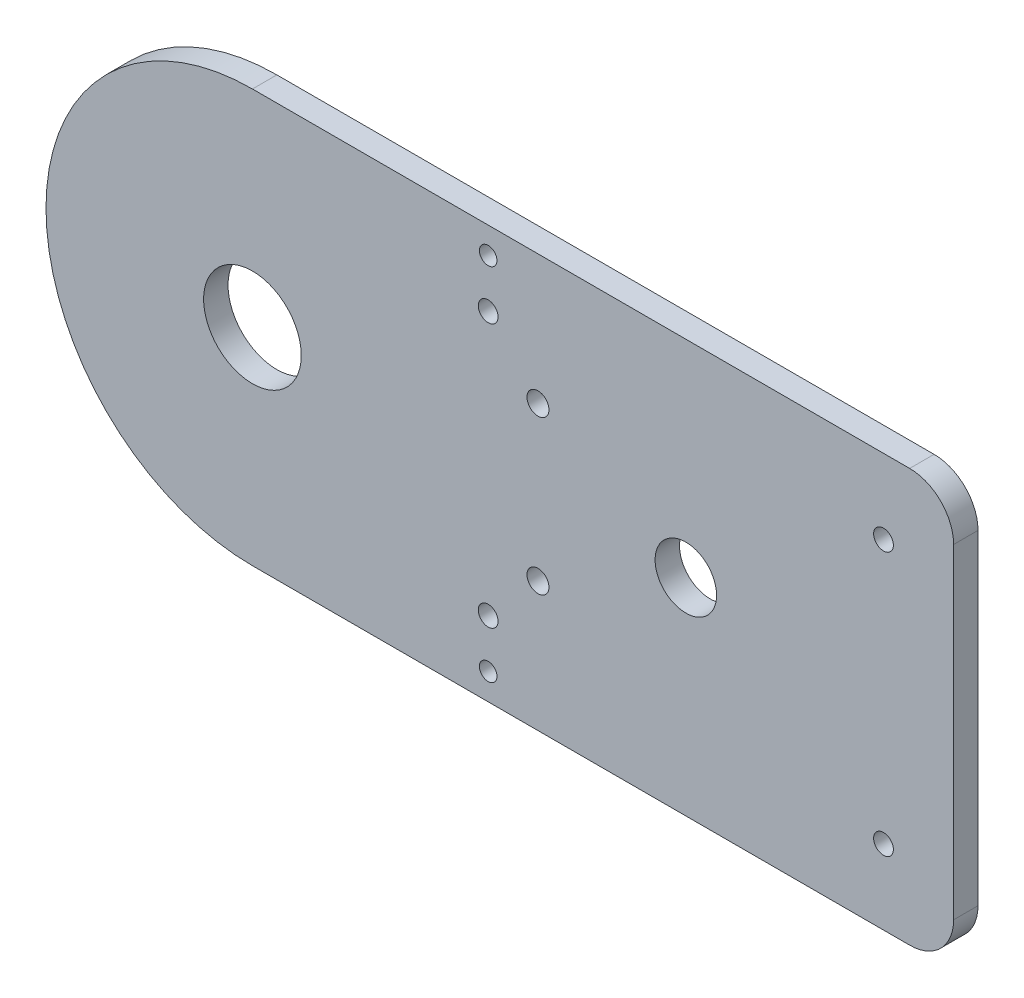
ISO-10303-21;
HEADER;
FILE_DESCRIPTION(('STEP AP214'),'2;1');
FILE_NAME('part.step','',(''),(''),'','','');
FILE_SCHEMA(('AUTOMOTIVE_DESIGN { 1 0 10303 214 1 1 1 1 }'));
ENDSEC;
DATA;
#1=APPLICATION_CONTEXT('core data for automotive mechanical design processes');
#2=APPLICATION_PROTOCOL_DEFINITION('international standard','automotive_design',2000,#1);
#3=PRODUCT_CONTEXT('',#1,'mechanical');
#4=PRODUCT('Part','Part','',(#3));
#5=PRODUCT_RELATED_PRODUCT_CATEGORY('part','',(#4));
#6=PRODUCT_DEFINITION_FORMATION('','',#4);
#7=PRODUCT_DEFINITION_CONTEXT('part definition',#1,'design');
#8=PRODUCT_DEFINITION('design','',#6,#7);
#9=PRODUCT_DEFINITION_SHAPE('','',#8);
#10=(LENGTH_UNIT() NAMED_UNIT(*) SI_UNIT(.MILLI.,.METRE.));
#11=(NAMED_UNIT(*) PLANE_ANGLE_UNIT() SI_UNIT($,.RADIAN.));
#12=(NAMED_UNIT(*) SI_UNIT($,.STERADIAN.) SOLID_ANGLE_UNIT());
#13=UNCERTAINTY_MEASURE_WITH_UNIT(LENGTH_MEASURE(1.E-05),#10,'distance_accuracy_value','');
#14=(GEOMETRIC_REPRESENTATION_CONTEXT(3) GLOBAL_UNCERTAINTY_ASSIGNED_CONTEXT((#13)) GLOBAL_UNIT_ASSIGNED_CONTEXT((#10,
#11,#12)) REPRESENTATION_CONTEXT('',''));
#15=CARTESIAN_POINT('',(0.,0.,0.));
#16=DIRECTION('',(0.,0.,1.));
#17=DIRECTION('',(1.,0.,0.));
#18=AXIS2_PLACEMENT_3D('',#15,#16,#17);
#19=CARTESIAN_POINT('',(-65.,0.,5.55625));
#20=DIRECTION('',(0.,0.,1.));
#21=DIRECTION('',(1.,0.,0.));
#22=AXIS2_PLACEMENT_3D('',#19,#20,#21);
#23=PLANE('',#22);
#24=CARTESIAN_POINT('',(0.,17.5,5.55625));
#25=DIRECTION('',(0.,0.,1.));
#26=DIRECTION('',(1.,0.,0.));
#27=AXIS2_PLACEMENT_3D('',#24,#25,#26);
#28=CIRCLE('',#27,2.5);
#29=CARTESIAN_POINT('',(2.49999999999999,17.5,5.55625));
#30=VERTEX_POINT('',#29);
#31=EDGE_CURVE('E151',#30,#30,#28,.T.);
#32=ORIENTED_EDGE('',*,*,#31,.F.);
#33=EDGE_LOOP('',(#32));
#34=FACE_BOUND('',#33,.T.);
#35=CARTESIAN_POINT('',(0.,-17.5,5.55625));
#36=DIRECTION('',(0.,0.,1.));
#37=DIRECTION('',(1.,0.,0.));
#38=AXIS2_PLACEMENT_3D('',#35,#36,#37);
#39=CIRCLE('',#38,2.5);
#40=CARTESIAN_POINT('',(2.5,-17.5,5.55625));
#41=VERTEX_POINT('',#40);
#42=EDGE_CURVE('E157',#41,#41,#39,.T.);
#43=ORIENTED_EDGE('',*,*,#42,.F.);
#44=EDGE_LOOP('',(#43));
#45=FACE_BOUND('',#44,.T.);
#46=CARTESIAN_POINT('',(-11.3336023189377,41.,5.55625));
#47=DIRECTION('',(0.,0.,1.));
#48=DIRECTION('',(1.,0.,0.));
#49=AXIS2_PLACEMENT_3D('',#46,#47,#48);
#50=CIRCLE('',#49,2.);
#51=CARTESIAN_POINT('',(-9.33360231893767,41.,5.55625));
#52=VERTEX_POINT('',#51);
#53=EDGE_CURVE('E155',#52,#52,#50,.T.);
#54=ORIENTED_EDGE('',*,*,#53,.F.);
#55=EDGE_LOOP('',(#54));
#56=FACE_BOUND('',#55,.T.);
#57=CARTESIAN_POINT('',(78.6663976810623,-30.,5.55625));
#58=DIRECTION('',(0.,0.,1.));
#59=DIRECTION('',(1.,0.,0.));
#60=AXIS2_PLACEMENT_3D('',#57,#58,#59);
#61=CIRCLE('',#60,2.25);
#62=CARTESIAN_POINT('',(80.9163976810623,-30.,5.55625));
#63=VERTEX_POINT('',#62);
#64=EDGE_CURVE('E171',#63,#63,#61,.T.);
#65=ORIENTED_EDGE('',*,*,#64,.F.);
#66=EDGE_LOOP('',(#65));
#67=FACE_BOUND('',#66,.T.);
#68=CARTESIAN_POINT('',(-11.3336023189377,30.,5.55625));
#69=DIRECTION('',(0.,0.,1.));
#70=DIRECTION('',(1.,0.,0.));
#71=AXIS2_PLACEMENT_3D('',#68,#69,#70);
#72=CIRCLE('',#71,2.25);
#73=CARTESIAN_POINT('',(-9.08360231893768,30.,5.55625));
#74=VERTEX_POINT('',#73);
#75=EDGE_CURVE('E167',#74,#74,#72,.T.);
#76=ORIENTED_EDGE('',*,*,#75,.F.);
#77=EDGE_LOOP('',(#76));
#78=FACE_BOUND('',#77,.T.);
#79=CARTESIAN_POINT('',(-11.3336023189377,-30.,5.55625));
#80=DIRECTION('',(0.,0.,1.));
#81=DIRECTION('',(1.,0.,0.));
#82=AXIS2_PLACEMENT_3D('',#79,#80,#81);
#83=CIRCLE('',#82,2.25);
#84=CARTESIAN_POINT('',(-9.08360231893768,-30.,5.55625));
#85=VERTEX_POINT('',#84);
#86=EDGE_CURVE('E164',#85,#85,#83,.T.);
#87=ORIENTED_EDGE('',*,*,#86,.F.);
#88=EDGE_LOOP('',(#87));
#89=FACE_BOUND('',#88,.T.);
#90=CARTESIAN_POINT('',(-11.3336023189377,-41.,5.55625));
#91=DIRECTION('',(0.,0.,1.));
#92=DIRECTION('',(1.,0.,0.));
#93=AXIS2_PLACEMENT_3D('',#90,#91,#92);
#94=CIRCLE('',#93,2.);
#95=CARTESIAN_POINT('',(-9.33360231893767,-41.,5.55625));
#96=VERTEX_POINT('',#95);
#97=EDGE_CURVE('E168',#96,#96,#94,.T.);
#98=ORIENTED_EDGE('',*,*,#97,.F.);
#99=EDGE_LOOP('',(#98));
#100=FACE_BOUND('',#99,.T.);
#101=CARTESIAN_POINT('',(78.6663976810623,30.,5.55625));
#102=DIRECTION('',(0.,0.,1.));
#103=DIRECTION('',(1.,0.,0.));
#104=AXIS2_PLACEMENT_3D('',#101,#102,#103);
#105=CIRCLE('',#104,2.25);
#106=CARTESIAN_POINT('',(80.9163976810623,30.,5.55625));
#107=VERTEX_POINT('',#106);
#108=EDGE_CURVE('E134',#107,#107,#105,.T.);
#109=ORIENTED_EDGE('',*,*,#108,.F.);
#110=EDGE_LOOP('',(#109));
#111=FACE_BOUND('',#110,.T.);
#112=CARTESIAN_POINT('',(33.6663976810623,0.,5.55625));
#113=DIRECTION('',(0.,0.,1.));
#114=DIRECTION('',(1.,0.,0.));
#115=AXIS2_PLACEMENT_3D('',#112,#113,#114);
#116=CIRCLE('',#115,7.);
#117=CARTESIAN_POINT('',(40.6663976810623,0.,5.55625));
#118=VERTEX_POINT('',#117);
#119=EDGE_CURVE('E148',#118,#118,#116,.T.);
#120=ORIENTED_EDGE('',*,*,#119,.F.);
#121=EDGE_LOOP('',(#120));
#122=FACE_BOUND('',#121,.T.);
#123=DIRECTION('',(1.,0.,0.));
#124=VECTOR('',#123,1.);
#125=CARTESIAN_POINT('',(94.62424518,-47.,5.55625));
#126=LINE('',#125,#124);
#127=CARTESIAN_POINT('',(-65.,-47.,5.55625));
#128=VERTEX_POINT('',#127);
#129=CARTESIAN_POINT('',(84.62424518,-47.,5.55625));
#130=VERTEX_POINT('',#129);
#131=EDGE_CURVE('E92',#128,#130,#126,.T.);
#132=ORIENTED_EDGE('',*,*,#131,.T.);
#133=CARTESIAN_POINT('',(84.62424518,-37.,5.55625));
#134=DIRECTION('',(0.,0.,1.));
#135=DIRECTION('',(1.,0.,0.));
#136=AXIS2_PLACEMENT_3D('',#133,#134,#135);
#137=CIRCLE('',#136,10.);
#138=CARTESIAN_POINT('',(94.62424518,-37.,5.55625));
#139=VERTEX_POINT('',#138);
#140=EDGE_CURVE('E46',#130,#139,#137,.T.);
#141=ORIENTED_EDGE('',*,*,#140,.T.);
#142=DIRECTION('',(0.,1.,0.));
#143=VECTOR('',#142,1.);
#144=CARTESIAN_POINT('',(94.62424518,47.,5.55625));
#145=LINE('',#144,#143);
#146=CARTESIAN_POINT('',(94.62424518,37.,5.55625));
#147=VERTEX_POINT('',#146);
#148=EDGE_CURVE('E99',#139,#147,#145,.T.);
#149=ORIENTED_EDGE('',*,*,#148,.T.);
#150=CARTESIAN_POINT('',(84.62424518,37.,5.55625));
#151=DIRECTION('',(0.,0.,1.));
#152=DIRECTION('',(1.,0.,0.));
#153=AXIS2_PLACEMENT_3D('',#150,#151,#152);
#154=CIRCLE('',#153,10.);
#155=CARTESIAN_POINT('',(84.62424518,47.,5.55625));
#156=VERTEX_POINT('',#155);
#157=EDGE_CURVE('E54',#147,#156,#154,.T.);
#158=ORIENTED_EDGE('',*,*,#157,.T.);
#159=DIRECTION('',(-1.,0.,0.));
#160=VECTOR('',#159,1.);
#161=CARTESIAN_POINT('',(-65.,47.,5.55625));
#162=LINE('',#161,#160);
#163=CARTESIAN_POINT('',(-65.,47.,5.55625));
#164=VERTEX_POINT('',#163);
#165=EDGE_CURVE('E104',#156,#164,#162,.T.);
#166=ORIENTED_EDGE('',*,*,#165,.T.);
#167=CARTESIAN_POINT('',(-65.,0.,5.55625));
#168=DIRECTION('',(0.,0.,1.));
#169=DIRECTION('',(1.,0.,0.));
#170=AXIS2_PLACEMENT_3D('',#167,#168,#169);
#171=CIRCLE('',#170,47.);
#172=EDGE_CURVE('E100',#164,#128,#171,.T.);
#173=ORIENTED_EDGE('',*,*,#172,.T.);
#174=EDGE_LOOP('',(#132,#141,#149,#158,#166,#173));
#175=FACE_BOUND('',#174,.T.);
#176=CARTESIAN_POINT('',(-65.,0.,5.55625));
#177=DIRECTION('',(0.,0.,1.));
#178=DIRECTION('',(1.,0.,0.));
#179=AXIS2_PLACEMENT_3D('',#176,#177,#178);
#180=CIRCLE('',#179,11.1125);
#181=CARTESIAN_POINT('',(-53.8875,0.,5.55625));
#182=VERTEX_POINT('',#181);
#183=EDGE_CURVE('E186',#182,#182,#180,.T.);
#184=ORIENTED_EDGE('',*,*,#183,.F.);
#185=EDGE_LOOP('',(#184));
#186=FACE_BOUND('',#185,.T.);
#187=ADVANCED_FACE('F37',(#34,#45,#56,#67,#78,#89,#100,#111,#122,#175,#186),#23,.T.);
#188=CARTESIAN_POINT('',(-65.,0.,0.));
#189=DIRECTION('',(0.,0.,1.));
#190=DIRECTION('',(1.,0.,0.));
#191=AXIS2_PLACEMENT_3D('',#188,#189,#190);
#192=PLANE('',#191);
#193=CARTESIAN_POINT('',(0.,17.5,0.));
#194=DIRECTION('',(0.,0.,1.));
#195=DIRECTION('',(1.,0.,0.));
#196=AXIS2_PLACEMENT_3D('',#193,#194,#195);
#197=CIRCLE('',#196,2.5);
#198=CARTESIAN_POINT('',(2.49999999999999,17.5,0.));
#199=VERTEX_POINT('',#198);
#200=EDGE_CURVE('E41',#199,#199,#197,.T.);
#201=ORIENTED_EDGE('',*,*,#200,.T.);
#202=EDGE_LOOP('',(#201));
#203=FACE_BOUND('',#202,.T.);
#204=CARTESIAN_POINT('',(0.,-17.5,0.));
#205=DIRECTION('',(0.,0.,1.));
#206=DIRECTION('',(1.,0.,0.));
#207=AXIS2_PLACEMENT_3D('',#204,#205,#206);
#208=CIRCLE('',#207,2.5);
#209=CARTESIAN_POINT('',(2.5,-17.5,0.));
#210=VERTEX_POINT('',#209);
#211=EDGE_CURVE('E149',#210,#210,#208,.T.);
#212=ORIENTED_EDGE('',*,*,#211,.T.);
#213=EDGE_LOOP('',(#212));
#214=FACE_BOUND('',#213,.T.);
#215=CARTESIAN_POINT('',(-11.3336023189377,41.,0.));
#216=DIRECTION('',(0.,0.,1.));
#217=DIRECTION('',(1.,0.,0.));
#218=AXIS2_PLACEMENT_3D('',#215,#216,#217);
#219=CIRCLE('',#218,2.);
#220=CARTESIAN_POINT('',(-9.33360231893767,41.,0.));
#221=VERTEX_POINT('',#220);
#222=EDGE_CURVE('E146',#221,#221,#219,.T.);
#223=ORIENTED_EDGE('',*,*,#222,.T.);
#224=EDGE_LOOP('',(#223));
#225=FACE_BOUND('',#224,.T.);
#226=CARTESIAN_POINT('',(78.6663976810623,-30.,0.));
#227=DIRECTION('',(0.,0.,1.));
#228=DIRECTION('',(1.,0.,0.));
#229=AXIS2_PLACEMENT_3D('',#226,#227,#228);
#230=CIRCLE('',#229,2.25);
#231=CARTESIAN_POINT('',(80.9163976810623,-30.,0.));
#232=VERTEX_POINT('',#231);
#233=EDGE_CURVE('E143',#232,#232,#230,.T.);
#234=ORIENTED_EDGE('',*,*,#233,.T.);
#235=EDGE_LOOP('',(#234));
#236=FACE_BOUND('',#235,.T.);
#237=CARTESIAN_POINT('',(-11.3336023189377,30.,0.));
#238=DIRECTION('',(0.,0.,1.));
#239=DIRECTION('',(1.,0.,0.));
#240=AXIS2_PLACEMENT_3D('',#237,#238,#239);
#241=CIRCLE('',#240,2.25);
#242=CARTESIAN_POINT('',(-9.08360231893768,30.,0.));
#243=VERTEX_POINT('',#242);
#244=EDGE_CURVE('E140',#243,#243,#241,.T.);
#245=ORIENTED_EDGE('',*,*,#244,.T.);
#246=EDGE_LOOP('',(#245));
#247=FACE_BOUND('',#246,.T.);
#248=CARTESIAN_POINT('',(-11.3336023189377,-30.,0.));
#249=DIRECTION('',(0.,0.,1.));
#250=DIRECTION('',(1.,0.,0.));
#251=AXIS2_PLACEMENT_3D('',#248,#249,#250);
#252=CIRCLE('',#251,2.25);
#253=CARTESIAN_POINT('',(-9.08360231893768,-30.,0.));
#254=VERTEX_POINT('',#253);
#255=EDGE_CURVE('E137',#254,#254,#252,.T.);
#256=ORIENTED_EDGE('',*,*,#255,.T.);
#257=EDGE_LOOP('',(#256));
#258=FACE_BOUND('',#257,.T.);
#259=CARTESIAN_POINT('',(-11.3336023189377,-41.,0.));
#260=DIRECTION('',(0.,0.,1.));
#261=DIRECTION('',(1.,0.,0.));
#262=AXIS2_PLACEMENT_3D('',#259,#260,#261);
#263=CIRCLE('',#262,2.);
#264=CARTESIAN_POINT('',(-9.33360231893767,-41.,0.));
#265=VERTEX_POINT('',#264);
#266=EDGE_CURVE('E133',#265,#265,#263,.T.);
#267=ORIENTED_EDGE('',*,*,#266,.T.);
#268=EDGE_LOOP('',(#267));
#269=FACE_BOUND('',#268,.T.);
#270=CARTESIAN_POINT('',(78.6663976810623,30.,0.));
#271=DIRECTION('',(0.,0.,1.));
#272=DIRECTION('',(1.,0.,0.));
#273=AXIS2_PLACEMENT_3D('',#270,#271,#272);
#274=CIRCLE('',#273,2.25);
#275=CARTESIAN_POINT('',(80.9163976810623,30.,0.));
#276=VERTEX_POINT('',#275);
#277=EDGE_CURVE('E130',#276,#276,#274,.T.);
#278=ORIENTED_EDGE('',*,*,#277,.T.);
#279=EDGE_LOOP('',(#278));
#280=FACE_BOUND('',#279,.T.);
#281=CARTESIAN_POINT('',(33.6663976810623,0.,0.));
#282=DIRECTION('',(0.,0.,1.));
#283=DIRECTION('',(1.,0.,0.));
#284=AXIS2_PLACEMENT_3D('',#281,#282,#283);
#285=CIRCLE('',#284,7.);
#286=CARTESIAN_POINT('',(40.6663976810623,0.,0.));
#287=VERTEX_POINT('',#286);
#288=EDGE_CURVE('E180',#287,#287,#285,.T.);
#289=ORIENTED_EDGE('',*,*,#288,.T.);
#290=EDGE_LOOP('',(#289));
#291=FACE_BOUND('',#290,.T.);
#292=DIRECTION('',(0.,1.,0.));
#293=VECTOR('',#292,1.);
#294=CARTESIAN_POINT('',(94.62424518,47.,0.));
#295=LINE('',#294,#293);
#296=CARTESIAN_POINT('',(94.62424518,-37.,0.));
#297=VERTEX_POINT('',#296);
#298=CARTESIAN_POINT('',(94.62424518,37.,0.));
#299=VERTEX_POINT('',#298);
#300=EDGE_CURVE('E196',#297,#299,#295,.T.);
#301=ORIENTED_EDGE('',*,*,#300,.F.);
#302=CARTESIAN_POINT('',(84.62424518,-37.,0.));
#303=DIRECTION('',(0.,0.,1.));
#304=DIRECTION('',(1.,0.,0.));
#305=AXIS2_PLACEMENT_3D('',#302,#303,#304);
#306=CIRCLE('',#305,10.);
#307=CARTESIAN_POINT('',(84.62424518,-47.,0.));
#308=VERTEX_POINT('',#307);
#309=EDGE_CURVE('E125',#297,#308,#306,.F.);
#310=ORIENTED_EDGE('',*,*,#309,.T.);
#311=DIRECTION('',(1.,0.,0.));
#312=VECTOR('',#311,1.);
#313=CARTESIAN_POINT('',(94.62424518,-47.,0.));
#314=LINE('',#313,#312);
#315=CARTESIAN_POINT('',(-65.,-47.,0.));
#316=VERTEX_POINT('',#315);
#317=EDGE_CURVE('E194',#316,#308,#314,.T.);
#318=ORIENTED_EDGE('',*,*,#317,.F.);
#319=CARTESIAN_POINT('',(-65.,0.,0.));
#320=DIRECTION('',(0.,0.,1.));
#321=DIRECTION('',(1.,0.,0.));
#322=AXIS2_PLACEMENT_3D('',#319,#320,#321);
#323=CIRCLE('',#322,47.);
#324=CARTESIAN_POINT('',(-65.,47.,0.));
#325=VERTEX_POINT('',#324);
#326=EDGE_CURVE('E112',#325,#316,#323,.T.);
#327=ORIENTED_EDGE('',*,*,#326,.F.);
#328=DIRECTION('',(-1.,0.,0.));
#329=VECTOR('',#328,1.);
#330=CARTESIAN_POINT('',(-65.,47.,0.));
#331=LINE('',#330,#329);
#332=CARTESIAN_POINT('',(84.62424518,47.,0.));
#333=VERTEX_POINT('',#332);
#334=EDGE_CURVE('E108',#333,#325,#331,.T.);
#335=ORIENTED_EDGE('',*,*,#334,.F.);
#336=CARTESIAN_POINT('',(84.62424518,37.,0.));
#337=DIRECTION('',(0.,0.,1.));
#338=DIRECTION('',(1.,0.,0.));
#339=AXIS2_PLACEMENT_3D('',#336,#337,#338);
#340=CIRCLE('',#339,10.);
#341=EDGE_CURVE('E123',#333,#299,#340,.F.);
#342=ORIENTED_EDGE('',*,*,#341,.T.);
#343=EDGE_LOOP('',(#301,#310,#318,#327,#335,#342));
#344=FACE_BOUND('',#343,.T.);
#345=CARTESIAN_POINT('',(-65.,0.,0.));
#346=DIRECTION('',(0.,0.,1.));
#347=DIRECTION('',(1.,0.,0.));
#348=AXIS2_PLACEMENT_3D('',#345,#346,#347);
#349=CIRCLE('',#348,11.1125);
#350=CARTESIAN_POINT('',(-53.8875,0.,0.));
#351=VERTEX_POINT('',#350);
#352=EDGE_CURVE('E183',#351,#351,#349,.T.);
#353=ORIENTED_EDGE('',*,*,#352,.T.);
#354=EDGE_LOOP('',(#353));
#355=FACE_BOUND('',#354,.T.);
#356=ADVANCED_FACE('F204',(#203,#214,#225,#236,#247,#258,#269,#280,#291,#344,#355),#192,.F.);
#357=CARTESIAN_POINT('',(-65.,0.,5.55625));
#358=DIRECTION('',(0.,0.,-1.));
#359=DIRECTION('',(-1.,0.,0.));
#360=AXIS2_PLACEMENT_3D('',#357,#358,#359);
#361=CYLINDRICAL_SURFACE('',#360,47.);
#362=ORIENTED_EDGE('',*,*,#326,.T.);
#363=DIRECTION('',(0.,0.,-1.));
#364=VECTOR('',#363,1.);
#365=CARTESIAN_POINT('',(-65.,-47.,5.55625));
#366=LINE('',#365,#364);
#367=EDGE_CURVE('E96',#128,#316,#366,.T.);
#368=ORIENTED_EDGE('',*,*,#367,.F.);
#369=ORIENTED_EDGE('',*,*,#172,.F.);
#370=DIRECTION('',(0.,0.,-1.));
#371=VECTOR('',#370,1.);
#372=CARTESIAN_POINT('',(-65.,47.,5.55625));
#373=LINE('',#372,#371);
#374=EDGE_CURVE('E114',#164,#325,#373,.T.);
#375=ORIENTED_EDGE('',*,*,#374,.T.);
#376=EDGE_LOOP('',(#362,#368,#369,#375));
#377=FACE_BOUND('',#376,.T.);
#378=ADVANCED_FACE('F110',(#377),#361,.T.);
#379=CARTESIAN_POINT('',(94.62424518,-47.,5.55625));
#380=DIRECTION('',(0.,1.,0.));
#381=DIRECTION('',(-1.,0.,0.));
#382=AXIS2_PLACEMENT_3D('',#379,#380,#381);
#383=PLANE('',#382);
#384=ORIENTED_EDGE('',*,*,#317,.T.);
#385=DIRECTION('',(0.,0.,-1.));
#386=VECTOR('',#385,1.);
#387=CARTESIAN_POINT('',(84.62424518,-47.,5.55625));
#388=LINE('',#387,#386);
#389=EDGE_CURVE('E62',#308,#130,#388,.F.);
#390=ORIENTED_EDGE('',*,*,#389,.T.);
#391=ORIENTED_EDGE('',*,*,#131,.F.);
#392=ORIENTED_EDGE('',*,*,#367,.T.);
#393=EDGE_LOOP('',(#384,#390,#391,#392));
#394=FACE_BOUND('',#393,.T.);
#395=ADVANCED_FACE('F94',(#394),#383,.F.);
#396=CARTESIAN_POINT('',(94.62424518,47.,5.55625));
#397=DIRECTION('',(-1.,0.,0.));
#398=DIRECTION('',(0.,0.,1.));
#399=AXIS2_PLACEMENT_3D('',#396,#397,#398);
#400=PLANE('',#399);
#401=ORIENTED_EDGE('',*,*,#148,.F.);
#402=DIRECTION('',(0.,0.,-1.));
#403=VECTOR('',#402,1.);
#404=CARTESIAN_POINT('',(94.62424518,-37.,5.55625));
#405=LINE('',#404,#403);
#406=EDGE_CURVE('E116',#139,#297,#405,.T.);
#407=ORIENTED_EDGE('',*,*,#406,.T.);
#408=ORIENTED_EDGE('',*,*,#300,.T.);
#409=DIRECTION('',(0.,0.,-1.));
#410=VECTOR('',#409,1.);
#411=CARTESIAN_POINT('',(94.62424518,37.,5.55625));
#412=LINE('',#411,#410);
#413=EDGE_CURVE('E113',#299,#147,#412,.F.);
#414=ORIENTED_EDGE('',*,*,#413,.T.);
#415=EDGE_LOOP('',(#401,#407,#408,#414));
#416=FACE_BOUND('',#415,.T.);
#417=ADVANCED_FACE('F211',(#416),#400,.F.);
#418=CARTESIAN_POINT('',(-65.,47.,5.55625));
#419=DIRECTION('',(0.,-1.,0.));
#420=DIRECTION('',(1.,0.,0.));
#421=AXIS2_PLACEMENT_3D('',#418,#419,#420);
#422=PLANE('',#421);
#423=ORIENTED_EDGE('',*,*,#165,.F.);
#424=DIRECTION('',(0.,0.,-1.));
#425=VECTOR('',#424,1.);
#426=CARTESIAN_POINT('',(84.62424518,47.,5.55625));
#427=LINE('',#426,#425);
#428=EDGE_CURVE('E11',#156,#333,#427,.T.);
#429=ORIENTED_EDGE('',*,*,#428,.T.);
#430=ORIENTED_EDGE('',*,*,#334,.T.);
#431=ORIENTED_EDGE('',*,*,#374,.F.);
#432=EDGE_LOOP('',(#423,#429,#430,#431));
#433=FACE_BOUND('',#432,.T.);
#434=ADVANCED_FACE('F200',(#433),#422,.F.);
#435=CARTESIAN_POINT('',(-65.,0.,5.55625));
#436=DIRECTION('',(0.,0.,-1.));
#437=DIRECTION('',(-1.,0.,0.));
#438=AXIS2_PLACEMENT_3D('',#435,#436,#437);
#439=CYLINDRICAL_SURFACE('',#438,11.1125);
#440=ORIENTED_EDGE('',*,*,#183,.T.);
#441=EDGE_LOOP('',(#440));
#442=FACE_BOUND('',#441,.T.);
#443=ORIENTED_EDGE('',*,*,#352,.F.);
#444=EDGE_LOOP('',(#443));
#445=FACE_BOUND('',#444,.T.);
#446=ADVANCED_FACE('F234',(#442,#445),#439,.F.);
#447=CARTESIAN_POINT('',(33.6663976810623,0.,0.));
#448=DIRECTION('',(0.,0.,1.));
#449=DIRECTION('',(1.,0.,0.));
#450=AXIS2_PLACEMENT_3D('',#447,#448,#449);
#451=CYLINDRICAL_SURFACE('',#450,7.);
#452=ORIENTED_EDGE('',*,*,#288,.F.);
#453=EDGE_LOOP('',(#452));
#454=FACE_BOUND('',#453,.T.);
#455=ORIENTED_EDGE('',*,*,#119,.T.);
#456=EDGE_LOOP('',(#455));
#457=FACE_BOUND('',#456,.T.);
#458=ADVANCED_FACE('F223',(#454,#457),#451,.F.);
#459=CARTESIAN_POINT('',(84.62424518,-37.,5.55625));
#460=DIRECTION('',(0.,0.,-1.));
#461=DIRECTION('',(-1.,0.,0.));
#462=AXIS2_PLACEMENT_3D('',#459,#460,#461);
#463=CYLINDRICAL_SURFACE('',#462,10.);
#464=ORIENTED_EDGE('',*,*,#140,.F.);
#465=ORIENTED_EDGE('',*,*,#389,.F.);
#466=ORIENTED_EDGE('',*,*,#309,.F.);
#467=ORIENTED_EDGE('',*,*,#406,.F.);
#468=EDGE_LOOP('',(#464,#465,#466,#467));
#469=FACE_BOUND('',#468,.T.);
#470=ADVANCED_FACE('F207',(#469),#463,.T.);
#471=CARTESIAN_POINT('',(84.62424518,37.,5.55625));
#472=DIRECTION('',(0.,0.,-1.));
#473=DIRECTION('',(-1.,0.,0.));
#474=AXIS2_PLACEMENT_3D('',#471,#472,#473);
#475=CYLINDRICAL_SURFACE('',#474,10.);
#476=ORIENTED_EDGE('',*,*,#157,.F.);
#477=ORIENTED_EDGE('',*,*,#413,.F.);
#478=ORIENTED_EDGE('',*,*,#341,.F.);
#479=ORIENTED_EDGE('',*,*,#428,.F.);
#480=EDGE_LOOP('',(#476,#477,#478,#479));
#481=FACE_BOUND('',#480,.T.);
#482=ADVANCED_FACE('F39',(#481),#475,.T.);
#483=CARTESIAN_POINT('',(78.6663976810623,30.,-0.79375));
#484=DIRECTION('',(0.,0.,1.));
#485=DIRECTION('',(1.,0.,0.));
#486=AXIS2_PLACEMENT_3D('',#483,#484,#485);
#487=CYLINDRICAL_SURFACE('',#486,2.25);
#488=ORIENTED_EDGE('',*,*,#108,.T.);
#489=EDGE_LOOP('',(#488));
#490=FACE_BOUND('',#489,.T.);
#491=ORIENTED_EDGE('',*,*,#277,.F.);
#492=EDGE_LOOP('',(#491));
#493=FACE_BOUND('',#492,.T.);
#494=ADVANCED_FACE('F215',(#490,#493),#487,.F.);
#495=CARTESIAN_POINT('',(-11.3336023189377,-41.,-0.79375));
#496=DIRECTION('',(0.,0.,1.));
#497=DIRECTION('',(1.,0.,0.));
#498=AXIS2_PLACEMENT_3D('',#495,#496,#497);
#499=CYLINDRICAL_SURFACE('',#498,2.);
#500=ORIENTED_EDGE('',*,*,#97,.T.);
#501=EDGE_LOOP('',(#500));
#502=FACE_BOUND('',#501,.T.);
#503=ORIENTED_EDGE('',*,*,#266,.F.);
#504=EDGE_LOOP('',(#503));
#505=FACE_BOUND('',#504,.T.);
#506=ADVANCED_FACE('F220',(#502,#505),#499,.F.);
#507=CARTESIAN_POINT('',(-11.3336023189377,-30.,-0.79375));
#508=DIRECTION('',(0.,0.,1.));
#509=DIRECTION('',(1.,0.,0.));
#510=AXIS2_PLACEMENT_3D('',#507,#508,#509);
#511=CYLINDRICAL_SURFACE('',#510,2.25);
#512=ORIENTED_EDGE('',*,*,#86,.T.);
#513=EDGE_LOOP('',(#512));
#514=FACE_BOUND('',#513,.T.);
#515=ORIENTED_EDGE('',*,*,#255,.F.);
#516=EDGE_LOOP('',(#515));
#517=FACE_BOUND('',#516,.T.);
#518=ADVANCED_FACE('F298',(#514,#517),#511,.F.);
#519=CARTESIAN_POINT('',(-11.3336023189377,30.,-0.79375));
#520=DIRECTION('',(0.,0.,1.));
#521=DIRECTION('',(1.,0.,0.));
#522=AXIS2_PLACEMENT_3D('',#519,#520,#521);
#523=CYLINDRICAL_SURFACE('',#522,2.25);
#524=ORIENTED_EDGE('',*,*,#75,.T.);
#525=EDGE_LOOP('',(#524));
#526=FACE_BOUND('',#525,.T.);
#527=ORIENTED_EDGE('',*,*,#244,.F.);
#528=EDGE_LOOP('',(#527));
#529=FACE_BOUND('',#528,.T.);
#530=ADVANCED_FACE('F309',(#526,#529),#523,.F.);
#531=CARTESIAN_POINT('',(78.6663976810623,-30.,-0.79375));
#532=DIRECTION('',(0.,0.,1.));
#533=DIRECTION('',(1.,0.,0.));
#534=AXIS2_PLACEMENT_3D('',#531,#532,#533);
#535=CYLINDRICAL_SURFACE('',#534,2.25);
#536=ORIENTED_EDGE('',*,*,#64,.T.);
#537=EDGE_LOOP('',(#536));
#538=FACE_BOUND('',#537,.T.);
#539=ORIENTED_EDGE('',*,*,#233,.F.);
#540=EDGE_LOOP('',(#539));
#541=FACE_BOUND('',#540,.T.);
#542=ADVANCED_FACE('F320',(#538,#541),#535,.F.);
#543=CARTESIAN_POINT('',(-11.3336023189377,41.,-0.79375));
#544=DIRECTION('',(0.,0.,1.));
#545=DIRECTION('',(1.,0.,0.));
#546=AXIS2_PLACEMENT_3D('',#543,#544,#545);
#547=CYLINDRICAL_SURFACE('',#546,2.);
#548=ORIENTED_EDGE('',*,*,#53,.T.);
#549=EDGE_LOOP('',(#548));
#550=FACE_BOUND('',#549,.T.);
#551=ORIENTED_EDGE('',*,*,#222,.F.);
#552=EDGE_LOOP('',(#551));
#553=FACE_BOUND('',#552,.T.);
#554=ADVANCED_FACE('F331',(#550,#553),#547,.F.);
#555=CARTESIAN_POINT('',(0.,-17.5,-34.44375));
#556=DIRECTION('',(0.,0.,1.));
#557=DIRECTION('',(1.,0.,0.));
#558=AXIS2_PLACEMENT_3D('',#555,#556,#557);
#559=CYLINDRICAL_SURFACE('',#558,2.5);
#560=ORIENTED_EDGE('',*,*,#42,.T.);
#561=EDGE_LOOP('',(#560));
#562=FACE_BOUND('',#561,.T.);
#563=ORIENTED_EDGE('',*,*,#211,.F.);
#564=EDGE_LOOP('',(#563));
#565=FACE_BOUND('',#564,.T.);
#566=ADVANCED_FACE('F341',(#562,#565),#559,.F.);
#567=CARTESIAN_POINT('',(0.,17.5,-34.44375));
#568=DIRECTION('',(0.,0.,1.));
#569=DIRECTION('',(1.,0.,0.));
#570=AXIS2_PLACEMENT_3D('',#567,#568,#569);
#571=CYLINDRICAL_SURFACE('',#570,2.5);
#572=ORIENTED_EDGE('',*,*,#31,.T.);
#573=EDGE_LOOP('',(#572));
#574=FACE_BOUND('',#573,.T.);
#575=ORIENTED_EDGE('',*,*,#200,.F.);
#576=EDGE_LOOP('',(#575));
#577=FACE_BOUND('',#576,.T.);
#578=ADVANCED_FACE('F363',(#574,#577),#571,.F.);
#579=CLOSED_SHELL('',(#187,#356,#378,#395,#417,#434,#446,#458,#470,#482,#494,#506,#518,#530,
#542,#554,#566,#578));
#580=MANIFOLD_SOLID_BREP('B2',#579);
#581=ADVANCED_BREP_SHAPE_REPRESENTATION('',(#18,#580),#14);
#582=SHAPE_DEFINITION_REPRESENTATION(#9,#581);
ENDSEC;
END-ISO-10303-21;
